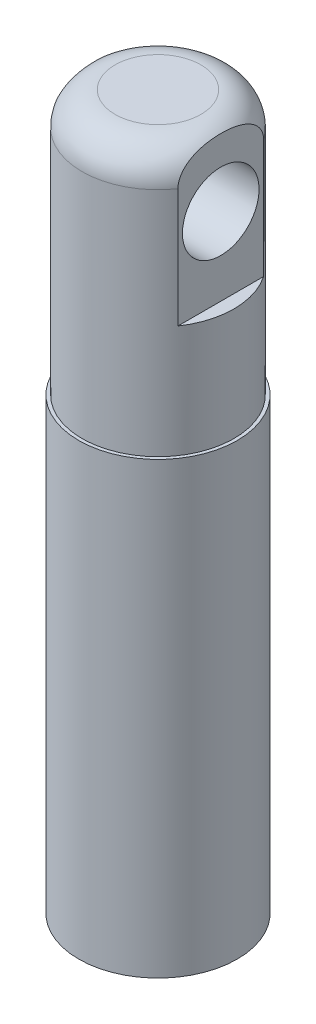
ISO-10303-21;
HEADER;
FILE_DESCRIPTION(('STEP AP214'),'2;1');
FILE_NAME('part.step','',(''),(''),'','','');
FILE_SCHEMA(('AUTOMOTIVE_DESIGN { 1 0 10303 214 1 1 1 1 }'));
ENDSEC;
DATA;
#1=APPLICATION_CONTEXT('core data for automotive mechanical design processes');
#2=APPLICATION_PROTOCOL_DEFINITION('international standard','automotive_design',2000,#1);
#3=PRODUCT_CONTEXT('',#1,'mechanical');
#4=PRODUCT('Part','Part','',(#3));
#5=PRODUCT_RELATED_PRODUCT_CATEGORY('part','',(#4));
#6=PRODUCT_DEFINITION_FORMATION('','',#4);
#7=PRODUCT_DEFINITION_CONTEXT('part definition',#1,'design');
#8=PRODUCT_DEFINITION('design','',#6,#7);
#9=PRODUCT_DEFINITION_SHAPE('','',#8);
#10=(LENGTH_UNIT() NAMED_UNIT(*) SI_UNIT(.MILLI.,.METRE.));
#11=(NAMED_UNIT(*) PLANE_ANGLE_UNIT() SI_UNIT($,.RADIAN.));
#12=(NAMED_UNIT(*) SI_UNIT($,.STERADIAN.) SOLID_ANGLE_UNIT());
#13=UNCERTAINTY_MEASURE_WITH_UNIT(LENGTH_MEASURE(1.E-05),#10,'distance_accuracy_value','');
#14=(GEOMETRIC_REPRESENTATION_CONTEXT(3) GLOBAL_UNCERTAINTY_ASSIGNED_CONTEXT((#13)) GLOBAL_UNIT_ASSIGNED_CONTEXT((#10,
#11,#12)) REPRESENTATION_CONTEXT('',''));
#15=CARTESIAN_POINT('',(0.,0.,0.));
#16=DIRECTION('',(0.,0.,1.));
#17=DIRECTION('',(1.,0.,0.));
#18=AXIS2_PLACEMENT_3D('',#15,#16,#17);
#19=CARTESIAN_POINT('',(0.,0.,0.));
#20=DIRECTION('',(0.,1.,0.));
#21=DIRECTION('',(0.,0.,1.));
#22=AXIS2_PLACEMENT_3D('',#19,#20,#21);
#23=PLANE('',#22);
#24=CARTESIAN_POINT('',(0.,0.,0.));
#25=DIRECTION('',(0.,-1.,0.));
#26=DIRECTION('',(0.,0.,-1.));
#27=AXIS2_PLACEMENT_3D('',#24,#25,#26);
#28=CIRCLE('',#27,9.5);
#29=CARTESIAN_POINT('',(0.,0.,-9.5));
#30=VERTEX_POINT('',#29);
#31=EDGE_CURVE('E112',#30,#30,#28,.T.);
#32=ORIENTED_EDGE('',*,*,#31,.F.);
#33=EDGE_LOOP('',(#32));
#34=FACE_BOUND('',#33,.T.);
#35=CARTESIAN_POINT('',(0.,0.,0.));
#36=DIRECTION('',(0.,-1.,0.));
#37=DIRECTION('',(0.,0.,-1.));
#38=AXIS2_PLACEMENT_3D('',#35,#36,#37);
#39=CIRCLE('',#38,12.);
#40=CARTESIAN_POINT('',(0.,0.,-12.));
#41=VERTEX_POINT('',#40);
#42=EDGE_CURVE('E325',#41,#41,#39,.T.);
#43=ORIENTED_EDGE('',*,*,#42,.T.);
#44=EDGE_LOOP('',(#43));
#45=FACE_BOUND('',#44,.T.);
#46=ADVANCED_FACE('F41',(#34,#45),#23,.F.);
#47=CARTESIAN_POINT('',(0.,80.,0.));
#48=DIRECTION('',(0.,-1.,0.));
#49=DIRECTION('',(0.,0.,-1.));
#50=AXIS2_PLACEMENT_3D('',#47,#48,#49);
#51=CYLINDRICAL_SURFACE('',#50,9.5);
#52=CARTESIAN_POINT('',(0.,8.99999999999999,0.));
#53=DIRECTION('',(0.,-1.,0.));
#54=DIRECTION('',(0.,0.,-1.));
#55=AXIS2_PLACEMENT_3D('',#52,#53,#54);
#56=CIRCLE('',#55,9.5);
#57=CARTESIAN_POINT('',(0.,8.99999999999999,-9.5));
#58=VERTEX_POINT('',#57);
#59=EDGE_CURVE('E90',#58,#58,#56,.F.);
#60=ORIENTED_EDGE('',*,*,#59,.T.);
#61=EDGE_LOOP('',(#60));
#62=FACE_BOUND('',#61,.T.);
#63=ORIENTED_EDGE('',*,*,#31,.T.);
#64=EDGE_LOOP('',(#63));
#65=FACE_BOUND('',#64,.T.);
#66=ADVANCED_FACE('F147',(#62,#65),#51,.F.);
#67=CARTESIAN_POINT('',(0.,9.,0.));
#68=DIRECTION('',(0.,-1.,0.));
#69=DIRECTION('',(0.,0.,-1.));
#70=AXIS2_PLACEMENT_3D('',#67,#68,#69);
#71=PLANE('',#70);
#72=CARTESIAN_POINT('',(0.,9.,0.));
#73=DIRECTION('',(0.,-1.,0.));
#74=DIRECTION('',(0.,0.,-1.));
#75=AXIS2_PLACEMENT_3D('',#72,#73,#74);
#76=CIRCLE('',#75,10.5);
#77=CARTESIAN_POINT('',(0.,9.,-10.5));
#78=VERTEX_POINT('',#77);
#79=EDGE_CURVE('E314',#78,#78,#76,.T.);
#80=ORIENTED_EDGE('',*,*,#79,.F.);
#81=EDGE_LOOP('',(#80));
#82=FACE_BOUND('',#81,.T.);
#83=ORIENTED_EDGE('',*,*,#59,.F.);
#84=EDGE_LOOP('',(#83));
#85=FACE_BOUND('',#84,.T.);
#86=ADVANCED_FACE('F150',(#82,#85),#71,.F.);
#87=CARTESIAN_POINT('',(0.,10.,0.));
#88=DIRECTION('',(0.,-1.,0.));
#89=DIRECTION('',(0.,0.,-1.));
#90=AXIS2_PLACEMENT_3D('',#87,#88,#89);
#91=PLANE('',#90);
#92=CARTESIAN_POINT('',(0.,10.,0.));
#93=DIRECTION('',(0.,-1.,0.));
#94=DIRECTION('',(0.,0.,-1.));
#95=AXIS2_PLACEMENT_3D('',#92,#93,#94);
#96=CIRCLE('',#95,10.5);
#97=CARTESIAN_POINT('',(0.,10.,-10.5));
#98=VERTEX_POINT('',#97);
#99=EDGE_CURVE('E318',#98,#98,#96,.T.);
#100=ORIENTED_EDGE('',*,*,#99,.T.);
#101=EDGE_LOOP('',(#100));
#102=FACE_BOUND('',#101,.T.);
#103=CARTESIAN_POINT('',(0.,9.99999999999999,0.));
#104=DIRECTION('',(0.,-1.,0.));
#105=DIRECTION('',(0.,0.,-1.));
#106=AXIS2_PLACEMENT_3D('',#103,#104,#105);
#107=CIRCLE('',#106,9.5);
#108=CARTESIAN_POINT('',(0.,9.99999999999999,-9.5));
#109=VERTEX_POINT('',#108);
#110=EDGE_CURVE('E312',#109,#109,#107,.F.);
#111=ORIENTED_EDGE('',*,*,#110,.T.);
#112=EDGE_LOOP('',(#111));
#113=FACE_BOUND('',#112,.T.);
#114=ADVANCED_FACE('F248',(#102,#113),#91,.T.);
#115=CARTESIAN_POINT('',(0.,9.,0.));
#116=DIRECTION('',(0.,1.,0.));
#117=DIRECTION('',(0.,0.,1.));
#118=AXIS2_PLACEMENT_3D('',#115,#116,#117);
#119=CYLINDRICAL_SURFACE('',#118,10.5);
#120=ORIENTED_EDGE('',*,*,#79,.T.);
#121=EDGE_LOOP('',(#120));
#122=FACE_BOUND('',#121,.T.);
#123=ORIENTED_EDGE('',*,*,#99,.F.);
#124=EDGE_LOOP('',(#123));
#125=FACE_BOUND('',#124,.T.);
#126=ADVANCED_FACE('F145',(#122,#125),#119,.F.);
#127=CARTESIAN_POINT('',(0.,80.,0.));
#128=DIRECTION('',(0.,-1.,0.));
#129=DIRECTION('',(0.,0.,-1.));
#130=AXIS2_PLACEMENT_3D('',#127,#128,#129);
#131=PLANE('',#130);
#132=CARTESIAN_POINT('',(0.,80.,0.));
#133=DIRECTION('',(0.,-1.,0.));
#134=DIRECTION('',(0.,0.,-1.));
#135=AXIS2_PLACEMENT_3D('',#132,#133,#134);
#136=CIRCLE('',#135,9.5);
#137=CARTESIAN_POINT('',(0.,80.,-9.5));
#138=VERTEX_POINT('',#137);
#139=EDGE_CURVE('E114',#138,#138,#136,.T.);
#140=ORIENTED_EDGE('',*,*,#139,.T.);
#141=EDGE_LOOP('',(#140));
#142=FACE_BOUND('',#141,.T.);
#143=ADVANCED_FACE('F141',(#142),#131,.T.);
#144=ORIENTED_EDGE('',*,*,#139,.F.);
#145=EDGE_LOOP('',(#144));
#146=FACE_BOUND('',#145,.T.);
#147=ORIENTED_EDGE('',*,*,#110,.F.);
#148=EDGE_LOOP('',(#147));
#149=FACE_BOUND('',#148,.T.);
#150=ADVANCED_FACE('F144',(#146,#149),#51,.F.);
#151=CARTESIAN_POINT('',(0.,68.,0.));
#152=DIRECTION('',(0.,-1.,0.));
#153=DIRECTION('',(0.,0.,-1.));
#154=AXIS2_PLACEMENT_3D('',#151,#152,#153);
#155=CYLINDRICAL_SURFACE('',#154,12.);
#156=CARTESIAN_POINT('',(0.,68.,0.));
#157=DIRECTION('',(0.,-1.,0.));
#158=DIRECTION('',(0.,0.,-1.));
#159=AXIS2_PLACEMENT_3D('',#156,#157,#158);
#160=CIRCLE('',#159,12.);
#161=CARTESIAN_POINT('',(0.,68.,-12.));
#162=VERTEX_POINT('',#161);
#163=EDGE_CURVE('E322',#162,#162,#160,.T.);
#164=ORIENTED_EDGE('',*,*,#163,.T.);
#165=EDGE_LOOP('',(#164));
#166=FACE_BOUND('',#165,.T.);
#167=ORIENTED_EDGE('',*,*,#42,.F.);
#168=EDGE_LOOP('',(#167));
#169=FACE_BOUND('',#168,.T.);
#170=ADVANCED_FACE('F215',(#166,#169),#155,.T.);
#171=CARTESIAN_POINT('',(0.,68.,0.));
#172=DIRECTION('',(0.,-1.,0.));
#173=DIRECTION('',(0.,0.,-1.));
#174=AXIS2_PLACEMENT_3D('',#171,#172,#173);
#175=PLANE('',#174);
#176=CARTESIAN_POINT('',(0.,68.,0.));
#177=DIRECTION('',(0.,-1.,0.));
#178=DIRECTION('',(0.,0.,-1.));
#179=AXIS2_PLACEMENT_3D('',#176,#177,#178);
#180=CIRCLE('',#179,11.5);
#181=CARTESIAN_POINT('',(0.,68.,-11.5));
#182=VERTEX_POINT('',#181);
#183=EDGE_CURVE('E11',#182,#182,#180,.T.);
#184=ORIENTED_EDGE('',*,*,#183,.T.);
#185=EDGE_LOOP('',(#184));
#186=FACE_BOUND('',#185,.T.);
#187=ORIENTED_EDGE('',*,*,#163,.F.);
#188=EDGE_LOOP('',(#187));
#189=FACE_BOUND('',#188,.T.);
#190=ADVANCED_FACE('F155',(#186,#189),#175,.F.);
#191=CARTESIAN_POINT('',(0.,108.,0.));
#192=DIRECTION('',(0.,1.,0.));
#193=DIRECTION('',(0.,0.,1.));
#194=AXIS2_PLACEMENT_3D('',#191,#192,#193);
#195=PLANE('',#194);
#196=CARTESIAN_POINT('',(0.,108.,0.));
#197=DIRECTION('',(0.,1.,0.));
#198=DIRECTION('',(0.,0.,1.));
#199=AXIS2_PLACEMENT_3D('',#196,#197,#198);
#200=CIRCLE('',#199,6.5);
#201=CARTESIAN_POINT('',(0.,108.,6.5));
#202=VERTEX_POINT('',#201);
#203=EDGE_CURVE('E117',#202,#202,#200,.T.);
#204=ORIENTED_EDGE('',*,*,#203,.T.);
#205=EDGE_LOOP('',(#204));
#206=FACE_BOUND('',#205,.T.);
#207=ADVANCED_FACE('F152',(#206),#195,.T.);
#208=CARTESIAN_POINT('',(0.,85.,0.));
#209=DIRECTION('',(0.,1.,0.));
#210=DIRECTION('',(0.,0.,1.));
#211=AXIS2_PLACEMENT_3D('',#208,#209,#210);
#212=PLANE('',#211);
#213=CARTESIAN_POINT('',(0.,85.,0.));
#214=DIRECTION('',(0.,1.,0.));
#215=DIRECTION('',(0.,0.,1.));
#216=AXIS2_PLACEMENT_3D('',#213,#214,#215);
#217=CIRCLE('',#216,11.5);
#218=CARTESIAN_POINT('',(-9.5,85.,-6.48074069840787));
#219=VERTEX_POINT('',#218);
#220=CARTESIAN_POINT('',(-9.5,85.,6.48074069840787));
#221=VERTEX_POINT('',#220);
#222=EDGE_CURVE('E102',#219,#221,#217,.T.);
#223=ORIENTED_EDGE('',*,*,#222,.T.);
#224=DIRECTION('',(0.,0.,-1.));
#225=VECTOR('',#224,1.);
#226=CARTESIAN_POINT('',(-9.5,85.,-6.48074069840787));
#227=LINE('',#226,#225);
#228=EDGE_CURVE('E106',#221,#219,#227,.T.);
#229=ORIENTED_EDGE('',*,*,#228,.T.);
#230=EDGE_LOOP('',(#223,#229));
#231=FACE_BOUND('',#230,.T.);
#232=ADVANCED_FACE('F139',(#231),#212,.T.);
#233=CARTESIAN_POINT('',(-9.5,85.,-6.48074069840787));
#234=DIRECTION('',(1.,0.,0.));
#235=DIRECTION('',(0.,0.,-1.));
#236=AXIS2_PLACEMENT_3D('',#233,#234,#235);
#237=PLANE('',#236);
#238=CARTESIAN_POINT('',(-9.5,96.8,0.));
#239=DIRECTION('',(-1.,0.,0.));
#240=DIRECTION('',(0.,0.,1.));
#241=AXIS2_PLACEMENT_3D('',#238,#239,#240);
#242=CIRCLE('',#241,5.8);
#243=CARTESIAN_POINT('',(-9.5,96.8,5.8));
#244=VERTEX_POINT('',#243);
#245=EDGE_CURVE('E330',#244,#244,#242,.T.);
#246=ORIENTED_EDGE('',*,*,#245,.F.);
#247=EDGE_LOOP('',(#246));
#248=FACE_BOUND('',#247,.T.);
#249=CARTESIAN_POINT('',(-9.5,107.,0.));
#250=CARTESIAN_POINT('',(-9.5,107.000013449951,-0.319427822509701));
#251=CARTESIAN_POINT('',(-9.5,106.988017076986,-0.63892006590392));
#252=CARTESIAN_POINT('',(-9.5,106.938857323271,-1.27628521801685));
#253=CARTESIAN_POINT('',(-9.5,106.901671533057,-1.59415643068887));
#254=CARTESIAN_POINT('',(-9.5,106.798831607022,-2.22394198187162));
#255=CARTESIAN_POINT('',(-9.5,106.733305512437,-2.53587660109372));
#256=CARTESIAN_POINT('',(-9.5,106.568407722902,-3.15039211990225));
#257=CARTESIAN_POINT('',(-9.5,106.469101733711,-3.45298994361904));
#258=CARTESIAN_POINT('',(-9.5,106.257522124226,-3.97314599593014));
#259=CARTESIAN_POINT('',(-9.5,106.153666948261,-4.19408526995521));
#260=CARTESIAN_POINT('',(-9.5,105.918501990023,-4.62113765791603));
#261=CARTESIAN_POINT('',(-9.5,105.787187513449,-4.8272482287043));
#262=CARTESIAN_POINT('',(-9.5,105.492318517682,-5.21955935233824));
#263=CARTESIAN_POINT('',(-9.5,105.328400173196,-5.40549484136667));
#264=CARTESIAN_POINT('',(-9.5,105.058941889159,-5.65891095487052));
#265=CARTESIAN_POINT('',(-9.5,104.965236059143,-5.73910716779697));
#266=CARTESIAN_POINT('',(-9.5,104.77019289869,-5.88956112695986));
#267=CARTESIAN_POINT('',(-9.5,104.668859358059,-5.959823759372));
#268=CARTESIAN_POINT('',(-9.5,104.418624631359,-6.11367885088264));
#269=CARTESIAN_POINT('',(-9.5,104.266415813687,-6.19200770675544));
#270=CARTESIAN_POINT('',(-9.5,103.951141816376,-6.3223448961748));
#271=CARTESIAN_POINT('',(-9.5,103.788083924691,-6.37437070098581));
#272=CARTESIAN_POINT('',(-9.5,103.454530264585,-6.44907597407117));
#273=CARTESIAN_POINT('',(-9.5,103.284004842897,-6.4716248969513));
#274=CARTESIAN_POINT('',(-9.5,102.941691933726,-6.48533584975927));
#275=CARTESIAN_POINT('',(-9.5,102.769904604124,-6.47650174155386));
#276=CARTESIAN_POINT('',(-9.5,102.442562096056,-6.42979811026733));
#277=CARTESIAN_POINT('',(-9.5,102.286706826141,-6.39398232679889));
#278=CARTESIAN_POINT('',(-9.5,101.982810231776,-6.29786140515809));
#279=CARTESIAN_POINT('',(-9.5,101.834769406153,-6.23755470576261));
#280=CARTESIAN_POINT('',(-9.5,101.542535099,-6.09209283059815));
#281=CARTESIAN_POINT('',(-9.5,101.398873507225,-6.00587742881792));
#282=CARTESIAN_POINT('',(-9.5,101.125319379357,-5.81392724867521));
#283=CARTESIAN_POINT('',(-9.5,100.995435100828,-5.7081808671449));
#284=CARTESIAN_POINT('',(-9.5,100.687077862457,-5.42250045119694));
#285=CARTESIAN_POINT('',(-9.5,100.518012175842,-5.23239897739187));
#286=CARTESIAN_POINT('',(-9.5,100.212459774571,-4.82765362850405));
#287=CARTESIAN_POINT('',(-9.5,100.076039207576,-4.61296120489021));
#288=CARTESIAN_POINT('',(-9.5,99.8614050292085,-4.22000411781555));
#289=CARTESIAN_POINT('',(-9.5,99.7770446525986,-4.04501383563985));
#290=CARTESIAN_POINT('',(-9.5,99.6239155649386,-3.68826875505267));
#291=CARTESIAN_POINT('',(-9.5,99.5551556707456,-3.50651019865708));
#292=CARTESIAN_POINT('',(-9.5,99.4314555977816,-3.13786064624299));
#293=CARTESIAN_POINT('',(-9.5,99.376553665877,-2.95095699137289));
#294=CARTESIAN_POINT('',(-9.5,99.2792546930605,-2.57388268082105));
#295=CARTESIAN_POINT('',(-9.5,99.2368622262308,-2.38371085696474));
#296=CARTESIAN_POINT('',(-9.5,99.168993365226,-2.03079962649426));
#297=CARTESIAN_POINT('',(-9.5,99.1419151969633,-1.8683626717927));
#298=CARTESIAN_POINT('',(-9.5,99.09514785924,-1.54241049941394));
#299=CARTESIAN_POINT('',(-9.5,99.0754597373571,-1.37889513220662));
#300=CARTESIAN_POINT('',(-9.5,99.0429819616578,-1.05107016872485));
#301=CARTESIAN_POINT('',(-9.5,99.0301972358177,-0.886760089343081));
#302=CARTESIAN_POINT('',(-9.5,99.011221076751,-0.557740366031048));
#303=CARTESIAN_POINT('',(-9.5,99.0050305420207,-0.393030670714525));
#304=CARTESIAN_POINT('',(-9.5,98.9990862822697,-0.0635510949326198));
#305=CARTESIAN_POINT('',(-9.5,98.9993304162499,0.101218747273402));
#306=CARTESIAN_POINT('',(-9.5,99.0062561663826,0.430603318065509));
#307=CARTESIAN_POINT('',(-9.5,99.012936967878,0.595218063642268));
#308=CARTESIAN_POINT('',(-9.5,99.0329010231058,0.9239390966893));
#309=CARTESIAN_POINT('',(-9.5,99.0461798044369,1.08804565291549));
#310=CARTESIAN_POINT('',(-9.5,99.0796722559188,1.41553309087966));
#311=CARTESIAN_POINT('',(-9.5,99.0998850674893,1.57891405992492));
#312=CARTESIAN_POINT('',(-9.5,99.1508414082791,1.92570414329739));
#313=CARTESIAN_POINT('',(-9.5,99.1826101250516,2.10896513652259));
#314=CARTESIAN_POINT('',(-9.5,99.2565602438848,2.47334425431144));
#315=CARTESIAN_POINT('',(-9.5,99.2987389698424,2.65446291708439));
#316=CARTESIAN_POINT('',(-9.5,99.3945991213125,3.01331979926301));
#317=CARTESIAN_POINT('',(-9.5,99.4482594339486,3.19106358006571));
#318=CARTESIAN_POINT('',(-9.5,99.5684469730573,3.54210211143921));
#319=CARTESIAN_POINT('',(-9.5,99.634970504026,3.71539812366123));
#320=CARTESIAN_POINT('',(-9.5,99.8179794399782,4.13813901146517));
#321=CARTESIAN_POINT('',(-9.5,99.9430828956434,4.38397198031803));
#322=CARTESIAN_POINT('',(-9.5,100.229597654657,4.85372803849165));
#323=CARTESIAN_POINT('',(-9.5,100.390961000338,5.07767951218125));
#324=CARTESIAN_POINT('',(-9.5,100.704827566521,5.43634978188837));
#325=CARTESIAN_POINT('',(-9.5,100.848267240981,5.5789574271694));
#326=CARTESIAN_POINT('',(-9.5,101.156161398147,5.83942978403776));
#327=CARTESIAN_POINT('',(-9.5,101.320589340709,5.95732525567386));
#328=CARTESIAN_POINT('',(-9.5,101.641201141389,6.14560462799638));
#329=CARTESIAN_POINT('',(-9.5,101.794712127358,6.22052046658114));
#330=CARTESIAN_POINT('',(-9.5,102.11215130195,6.34369074182498));
#331=CARTESIAN_POINT('',(-9.5,102.276075071065,6.39195640644751));
#332=CARTESIAN_POINT('',(-9.5,102.61061133413,6.45888801308082));
#333=CARTESIAN_POINT('',(-9.5,102.781247974893,6.47743470200473));
#334=CARTESIAN_POINT('',(-9.5,103.123047475646,6.48323400014352));
#335=CARTESIAN_POINT('',(-9.5,103.294210258942,6.47049097272776));
#336=CARTESIAN_POINT('',(-9.5,103.619885561047,6.41656478854412));
#337=CARTESIAN_POINT('',(-9.5,103.774736919541,6.37738316882944));
#338=CARTESIAN_POINT('',(-9.5,104.076196474528,6.27494828890739));
#339=CARTESIAN_POINT('',(-9.5,104.222803697015,6.21169219124401));
#340=CARTESIAN_POINT('',(-9.5,104.513098470704,6.06002611127316));
#341=CARTESIAN_POINT('',(-9.5,104.656136026392,5.97038127987868));
#342=CARTESIAN_POINT('',(-9.5,104.928041234282,5.77183384519629));
#343=CARTESIAN_POINT('',(-9.5,105.05690243213,5.66292252843974));
#344=CARTESIAN_POINT('',(-9.5,105.364511604279,5.3675956630658));
#345=CARTESIAN_POINT('',(-9.5,105.533295230013,5.17078704006052));
#346=CARTESIAN_POINT('',(-9.5,105.837413356307,4.75267740204993));
#347=CARTESIAN_POINT('',(-9.5,105.972654995348,4.53131079376334));
#348=CARTESIAN_POINT('',(-9.5,106.185521890063,4.1250965782032));
#349=CARTESIAN_POINT('',(-9.5,106.269256938685,3.94337033918116));
#350=CARTESIAN_POINT('',(-9.5,106.420550885405,3.57322419441269));
#351=CARTESIAN_POINT('',(-9.5,106.488099778883,3.38480023101036));
#352=CARTESIAN_POINT('',(-9.5,106.608772897115,3.00337458169272));
#353=CARTESIAN_POINT('',(-9.5,106.661891601057,2.81037117435867));
#354=CARTESIAN_POINT('',(-9.5,106.755278253589,2.42135592845316));
#355=CARTESIAN_POINT('',(-9.5,106.795548880208,2.22534472576004));
#356=CARTESIAN_POINT('',(-9.5,106.859352949034,1.86120717466358));
#357=CARTESIAN_POINT('',(-9.5,106.884498154994,1.6933578247797));
#358=CARTESIAN_POINT('',(-9.5,106.927143905061,1.35670942886085));
#359=CARTESIAN_POINT('',(-9.5,106.944645016445,1.18791045424064));
#360=CARTESIAN_POINT('',(-9.5,106.972497660783,0.84940686905127));
#361=CARTESIAN_POINT('',(-9.5,106.982835640113,0.679701150599276));
#362=CARTESIAN_POINT('',(-9.5,106.996583611775,0.340003057349438));
#363=CARTESIAN_POINT('',(-9.5,106.999992841466,0.170010653057098));
#364=CARTESIAN_POINT('',(-9.5,107.,0.));
#365=B_SPLINE_CURVE_WITH_KNOTS('',3,(#249,#250,#251,#252,#253,#254,#255,#256,#257,#258,#259,
#260,#261,#262,#263,#264,#265,#266,#267,#268,#269,#270,#271,#272,#273,#274,#275,#276,#277,#278,
#279,#280,#281,#282,#283,#284,#285,#286,#287,#288,#289,#290,#291,#292,#293,#294,#295,#296,#297,
#298,#299,#300,#301,#302,#303,#304,#305,#306,#307,#308,#309,#310,#311,#312,#313,#314,#315,#316,
#317,#318,#319,#320,#321,#322,#323,#324,#325,#326,#327,#328,#329,#330,#331,#332,#333,#334,#335,
#336,#337,#338,#339,#340,#341,#342,#343,#344,#345,#346,#347,#348,#349,#350,#351,#352,#353,#354,
#355,#356,#357,#358,#359,#360,#361,#362,#363,#364),.UNSPECIFIED.,.T.,.F.,(4,2,2,2,2,2,2,2,2,2,2,
2,2,2,2,2,2,2,2,2,2,2,2,2,2,2,2,2,2,2,2,2,2,2,2,2,2,2,2,2,2,2,2,2,2,2,2,2,2,2,2,2,2,2,2,2,2,4),
(0.,0.958158207260657,1.91716994991136,2.87189342079582,3.82477036471835,4.55553429743221,
5.28642326010073,6.02597878492089,6.39545034158805,6.76473952381114,7.27603197711763,
7.78698436719131,8.30019205012159,8.81333658201243,9.29093444864841,9.76856276550992,
10.2692789491054,10.7702935658509,11.5292241492258,12.28967974688,12.8716819471224,
13.4540122601845,14.0379326050398,14.6220661963775,15.115926704169,15.6098571928589,
16.1041398083293,16.598489764023,17.0926752373688,17.586798172333,18.0805866250086,
18.5743139582438,19.1320194124377,19.6895816462353,20.2461272871279,20.8025132736631,
21.6274125334604,22.4512271291817,23.0558758575014,23.6597674308806,24.1700512325004,
24.6801198824995,25.1922302010158,25.7042691095026,26.1813420141754,26.6584711648366,
27.1629723240733,27.6677022352717,28.4411410611374,29.216697843817,29.8161501383794,
30.4159720026442,31.0160230292097,31.6159489004295,32.1249354584039,32.6338842374568,
33.1437934065381,33.653758697816),.UNSPECIFIED.);
#366=CARTESIAN_POINT('',(-9.5,103.,6.48074069840786));
#367=VERTEX_POINT('',#366);
#368=CARTESIAN_POINT('',(-9.5,103.000000000001,-6.48074069840787));
#369=VERTEX_POINT('',#368);
#370=EDGE_CURVE('E123',#367,#369,#365,.T.);
#371=ORIENTED_EDGE('',*,*,#370,.T.);
#372=DIRECTION('',(0.,1.,0.));
#373=VECTOR('',#372,1.);
#374=CARTESIAN_POINT('',(-9.5,85.,-6.48074069840787));
#375=LINE('',#374,#373);
#376=EDGE_CURVE('E110',#219,#369,#375,.T.);
#377=ORIENTED_EDGE('',*,*,#376,.F.);
#378=ORIENTED_EDGE('',*,*,#228,.F.);
#379=DIRECTION('',(0.,1.,0.));
#380=VECTOR('',#379,1.);
#381=CARTESIAN_POINT('',(-9.5,85.,6.48074069840787));
#382=LINE('',#381,#380);
#383=EDGE_CURVE('E109',#221,#367,#382,.T.);
#384=ORIENTED_EDGE('',*,*,#383,.T.);
#385=EDGE_LOOP('',(#371,#377,#378,#384));
#386=FACE_BOUND('',#385,.T.);
#387=ADVANCED_FACE('F134',(#248,#386),#237,.F.);
#388=CARTESIAN_POINT('',(0.,85.,0.));
#389=DIRECTION('',(0.,1.,0.));
#390=DIRECTION('',(0.,0.,1.));
#391=AXIS2_PLACEMENT_3D('',#388,#389,#390);
#392=PLANE('',#391);
#393=CARTESIAN_POINT('',(0.,85.,0.));
#394=DIRECTION('',(0.,1.,0.));
#395=DIRECTION('',(0.,0.,1.));
#396=AXIS2_PLACEMENT_3D('',#393,#394,#395);
#397=CIRCLE('',#396,11.5);
#398=CARTESIAN_POINT('',(9.5,85.,6.48074069840787));
#399=VERTEX_POINT('',#398);
#400=CARTESIAN_POINT('',(9.5,85.,-6.48074069840787));
#401=VERTEX_POINT('',#400);
#402=EDGE_CURVE('E87',#399,#401,#397,.T.);
#403=ORIENTED_EDGE('',*,*,#402,.T.);
#404=DIRECTION('',(0.,0.,1.));
#405=VECTOR('',#404,1.);
#406=CARTESIAN_POINT('',(9.5,85.,-6.48074069840787));
#407=LINE('',#406,#405);
#408=EDGE_CURVE('E89',#401,#399,#407,.T.);
#409=ORIENTED_EDGE('',*,*,#408,.T.);
#410=EDGE_LOOP('',(#403,#409));
#411=FACE_BOUND('',#410,.T.);
#412=ADVANCED_FACE('F88',(#411),#392,.T.);
#413=CARTESIAN_POINT('',(9.5,85.,-6.48074069840787));
#414=DIRECTION('',(-1.,0.,0.));
#415=DIRECTION('',(0.,0.,1.));
#416=AXIS2_PLACEMENT_3D('',#413,#414,#415);
#417=PLANE('',#416);
#418=CARTESIAN_POINT('',(9.5,96.8,0.));
#419=DIRECTION('',(-1.,0.,0.));
#420=DIRECTION('',(0.,0.,1.));
#421=AXIS2_PLACEMENT_3D('',#418,#419,#420);
#422=CIRCLE('',#421,5.8);
#423=CARTESIAN_POINT('',(9.5,96.8,5.8));
#424=VERTEX_POINT('',#423);
#425=EDGE_CURVE('E46',#424,#424,#422,.T.);
#426=ORIENTED_EDGE('',*,*,#425,.T.);
#427=EDGE_LOOP('',(#426));
#428=FACE_BOUND('',#427,.T.);
#429=CARTESIAN_POINT('',(9.5,107.,0.));
#430=CARTESIAN_POINT('',(9.5,107.000013449951,0.319427822509701));
#431=CARTESIAN_POINT('',(9.5,106.988017076986,0.63892006590392));
#432=CARTESIAN_POINT('',(9.5,106.938857323271,1.27628521801685));
#433=CARTESIAN_POINT('',(9.5,106.901671533057,1.59415643068887));
#434=CARTESIAN_POINT('',(9.5,106.798831607022,2.22394198187162));
#435=CARTESIAN_POINT('',(9.5,106.733305512437,2.53587660109372));
#436=CARTESIAN_POINT('',(9.5,106.568407722902,3.15039211990225));
#437=CARTESIAN_POINT('',(9.5,106.469101733711,3.45298994361904));
#438=CARTESIAN_POINT('',(9.5,106.257522124226,3.97314599593014));
#439=CARTESIAN_POINT('',(9.5,106.153666948261,4.19408526995521));
#440=CARTESIAN_POINT('',(9.5,105.918501990023,4.62113765791603));
#441=CARTESIAN_POINT('',(9.5,105.787187513449,4.8272482287043));
#442=CARTESIAN_POINT('',(9.5,105.492318517682,5.21955935233824));
#443=CARTESIAN_POINT('',(9.5,105.328400173196,5.40549484136667));
#444=CARTESIAN_POINT('',(9.5,105.058941889159,5.65891095487052));
#445=CARTESIAN_POINT('',(9.5,104.965236059143,5.73910716779697));
#446=CARTESIAN_POINT('',(9.5,104.77019289869,5.88956112695986));
#447=CARTESIAN_POINT('',(9.5,104.668859358059,5.959823759372));
#448=CARTESIAN_POINT('',(9.5,104.418624631359,6.11367885088264));
#449=CARTESIAN_POINT('',(9.5,104.266415813687,6.19200770675544));
#450=CARTESIAN_POINT('',(9.5,103.951141816376,6.3223448961748));
#451=CARTESIAN_POINT('',(9.5,103.788083924691,6.37437070098581));
#452=CARTESIAN_POINT('',(9.5,103.454530264585,6.44907597407117));
#453=CARTESIAN_POINT('',(9.5,103.284004842897,6.4716248969513));
#454=CARTESIAN_POINT('',(9.5,102.941691933726,6.48533584975927));
#455=CARTESIAN_POINT('',(9.5,102.769904604124,6.47650174155386));
#456=CARTESIAN_POINT('',(9.5,102.442562096056,6.42979811026733));
#457=CARTESIAN_POINT('',(9.5,102.286706826141,6.39398232679889));
#458=CARTESIAN_POINT('',(9.5,101.982810231776,6.29786140515809));
#459=CARTESIAN_POINT('',(9.5,101.834769406153,6.23755470576261));
#460=CARTESIAN_POINT('',(9.5,101.542535099,6.09209283059815));
#461=CARTESIAN_POINT('',(9.5,101.398873507225,6.00587742881792));
#462=CARTESIAN_POINT('',(9.5,101.125319379357,5.81392724867521));
#463=CARTESIAN_POINT('',(9.5,100.995435100828,5.7081808671449));
#464=CARTESIAN_POINT('',(9.5,100.687077862457,5.42250045119694));
#465=CARTESIAN_POINT('',(9.5,100.518012175842,5.23239897739187));
#466=CARTESIAN_POINT('',(9.5,100.212459774571,4.82765362850405));
#467=CARTESIAN_POINT('',(9.5,100.076039207576,4.61296120489021));
#468=CARTESIAN_POINT('',(9.5,99.8614050292085,4.22000411781555));
#469=CARTESIAN_POINT('',(9.5,99.7770446525986,4.04501383563985));
#470=CARTESIAN_POINT('',(9.5,99.6239155649386,3.68826875505267));
#471=CARTESIAN_POINT('',(9.5,99.5551556707456,3.50651019865708));
#472=CARTESIAN_POINT('',(9.5,99.4314555977816,3.13786064624299));
#473=CARTESIAN_POINT('',(9.5,99.376553665877,2.95095699137289));
#474=CARTESIAN_POINT('',(9.5,99.2792546930605,2.57388268082105));
#475=CARTESIAN_POINT('',(9.5,99.2368622262308,2.38371085696474));
#476=CARTESIAN_POINT('',(9.5,99.168993365226,2.03079962649426));
#477=CARTESIAN_POINT('',(9.5,99.1419151969633,1.8683626717927));
#478=CARTESIAN_POINT('',(9.5,99.09514785924,1.54241049941394));
#479=CARTESIAN_POINT('',(9.5,99.0754597373571,1.37889513220662));
#480=CARTESIAN_POINT('',(9.5,99.0429819616578,1.05107016872485));
#481=CARTESIAN_POINT('',(9.5,99.0301972358177,0.886760089343081));
#482=CARTESIAN_POINT('',(9.5,99.011221076751,0.557740366031048));
#483=CARTESIAN_POINT('',(9.5,99.0050305420207,0.393030670714525));
#484=CARTESIAN_POINT('',(9.5,98.9990862822697,0.0635510949326198));
#485=CARTESIAN_POINT('',(9.5,98.9993304162499,-0.101218747273402));
#486=CARTESIAN_POINT('',(9.5,99.0062561663826,-0.430603318065509));
#487=CARTESIAN_POINT('',(9.5,99.012936967878,-0.595218063642268));
#488=CARTESIAN_POINT('',(9.5,99.0329010231058,-0.9239390966893));
#489=CARTESIAN_POINT('',(9.5,99.0461798044369,-1.08804565291549));
#490=CARTESIAN_POINT('',(9.5,99.0796722559188,-1.41553309087966));
#491=CARTESIAN_POINT('',(9.5,99.0998850674893,-1.57891405992492));
#492=CARTESIAN_POINT('',(9.5,99.1508414082791,-1.92570414329739));
#493=CARTESIAN_POINT('',(9.5,99.1826101250516,-2.10896513652259));
#494=CARTESIAN_POINT('',(9.5,99.2565602438848,-2.47334425431144));
#495=CARTESIAN_POINT('',(9.5,99.2987389698424,-2.65446291708439));
#496=CARTESIAN_POINT('',(9.5,99.3945991213125,-3.01331979926301));
#497=CARTESIAN_POINT('',(9.5,99.4482594339486,-3.19106358006571));
#498=CARTESIAN_POINT('',(9.5,99.5684469730573,-3.54210211143921));
#499=CARTESIAN_POINT('',(9.5,99.634970504026,-3.71539812366123));
#500=CARTESIAN_POINT('',(9.5,99.8179794399782,-4.13813901146517));
#501=CARTESIAN_POINT('',(9.5,99.9430828956434,-4.38397198031803));
#502=CARTESIAN_POINT('',(9.5,100.229597654657,-4.85372803849165));
#503=CARTESIAN_POINT('',(9.5,100.390961000338,-5.07767951218125));
#504=CARTESIAN_POINT('',(9.5,100.704827566521,-5.43634978188837));
#505=CARTESIAN_POINT('',(9.5,100.848267240981,-5.5789574271694));
#506=CARTESIAN_POINT('',(9.5,101.156161398147,-5.83942978403776));
#507=CARTESIAN_POINT('',(9.5,101.320589340709,-5.95732525567386));
#508=CARTESIAN_POINT('',(9.5,101.641201141389,-6.14560462799638));
#509=CARTESIAN_POINT('',(9.5,101.794712127358,-6.22052046658114));
#510=CARTESIAN_POINT('',(9.5,102.11215130195,-6.34369074182498));
#511=CARTESIAN_POINT('',(9.5,102.276075071065,-6.39195640644751));
#512=CARTESIAN_POINT('',(9.5,102.61061133413,-6.45888801308082));
#513=CARTESIAN_POINT('',(9.5,102.781247974893,-6.47743470200473));
#514=CARTESIAN_POINT('',(9.5,103.123047475646,-6.48323400014352));
#515=CARTESIAN_POINT('',(9.5,103.294210258942,-6.47049097272776));
#516=CARTESIAN_POINT('',(9.5,103.619885561047,-6.41656478854412));
#517=CARTESIAN_POINT('',(9.5,103.774736919541,-6.37738316882944));
#518=CARTESIAN_POINT('',(9.5,104.076196474528,-6.27494828890739));
#519=CARTESIAN_POINT('',(9.5,104.222803697015,-6.21169219124401));
#520=CARTESIAN_POINT('',(9.5,104.513098470704,-6.06002611127316));
#521=CARTESIAN_POINT('',(9.5,104.656136026392,-5.97038127987868));
#522=CARTESIAN_POINT('',(9.5,104.928041234282,-5.77183384519629));
#523=CARTESIAN_POINT('',(9.5,105.05690243213,-5.66292252843974));
#524=CARTESIAN_POINT('',(9.5,105.364511604279,-5.3675956630658));
#525=CARTESIAN_POINT('',(9.5,105.533295230013,-5.17078704006052));
#526=CARTESIAN_POINT('',(9.5,105.837413356307,-4.75267740204993));
#527=CARTESIAN_POINT('',(9.5,105.972654995348,-4.53131079376334));
#528=CARTESIAN_POINT('',(9.5,106.185521890063,-4.1250965782032));
#529=CARTESIAN_POINT('',(9.5,106.269256938685,-3.94337033918116));
#530=CARTESIAN_POINT('',(9.5,106.420550885405,-3.57322419441269));
#531=CARTESIAN_POINT('',(9.5,106.488099778883,-3.38480023101036));
#532=CARTESIAN_POINT('',(9.5,106.608772897115,-3.00337458169272));
#533=CARTESIAN_POINT('',(9.5,106.661891601057,-2.81037117435867));
#534=CARTESIAN_POINT('',(9.5,106.755278253589,-2.42135592845316));
#535=CARTESIAN_POINT('',(9.5,106.795548880208,-2.22534472576004));
#536=CARTESIAN_POINT('',(9.5,106.859352949034,-1.86120717466358));
#537=CARTESIAN_POINT('',(9.5,106.884498154994,-1.6933578247797));
#538=CARTESIAN_POINT('',(9.5,106.927143905061,-1.35670942886085));
#539=CARTESIAN_POINT('',(9.5,106.944645016445,-1.18791045424064));
#540=CARTESIAN_POINT('',(9.5,106.972497660783,-0.84940686905127));
#541=CARTESIAN_POINT('',(9.5,106.982835640113,-0.679701150599276));
#542=CARTESIAN_POINT('',(9.5,106.996583611775,-0.340003057349438));
#543=CARTESIAN_POINT('',(9.5,106.999992841466,-0.170010653057098));
#544=CARTESIAN_POINT('',(9.5,107.,0.));
#545=B_SPLINE_CURVE_WITH_KNOTS('',3,(#429,#430,#431,#432,#433,#434,#435,#436,#437,#438,#439,
#440,#441,#442,#443,#444,#445,#446,#447,#448,#449,#450,#451,#452,#453,#454,#455,#456,#457,#458,
#459,#460,#461,#462,#463,#464,#465,#466,#467,#468,#469,#470,#471,#472,#473,#474,#475,#476,#477,
#478,#479,#480,#481,#482,#483,#484,#485,#486,#487,#488,#489,#490,#491,#492,#493,#494,#495,#496,
#497,#498,#499,#500,#501,#502,#503,#504,#505,#506,#507,#508,#509,#510,#511,#512,#513,#514,#515,
#516,#517,#518,#519,#520,#521,#522,#523,#524,#525,#526,#527,#528,#529,#530,#531,#532,#533,#534,
#535,#536,#537,#538,#539,#540,#541,#542,#543,#544),.UNSPECIFIED.,.T.,.F.,(4,2,2,2,2,2,2,2,2,2,2,
2,2,2,2,2,2,2,2,2,2,2,2,2,2,2,2,2,2,2,2,2,2,2,2,2,2,2,2,2,2,2,2,2,2,2,2,2,2,2,2,2,2,2,2,2,2,4),
(0.,0.958158207260657,1.91716994991136,2.87189342079582,3.82477036471835,4.55553429743221,
5.28642326010073,6.02597878492089,6.39545034158805,6.76473952381114,7.27603197711763,
7.78698436719131,8.30019205012159,8.81333658201243,9.29093444864841,9.76856276550992,
10.2692789491054,10.7702935658509,11.5292241492258,12.28967974688,12.8716819471224,
13.4540122601845,14.0379326050398,14.6220661963775,15.115926704169,15.6098571928589,
16.1041398083293,16.598489764023,17.0926752373688,17.586798172333,18.0805866250086,
18.5743139582438,19.1320194124377,19.6895816462353,20.2461272871279,20.8025132736631,
21.6274125334604,22.4512271291817,23.0558758575014,23.6597674308806,24.1700512325004,
24.6801198824995,25.1922302010158,25.7042691095026,26.1813420141754,26.6584711648366,
27.1629723240733,27.6677022352717,28.4411410611374,29.216697843817,29.8161501383794,
30.4159720026442,31.0160230292097,31.6159489004295,32.1249354584039,32.6338842374568,
33.1437934065381,33.653758697816),.UNSPECIFIED.);
#546=CARTESIAN_POINT('',(9.5,103.,-6.48074069840786));
#547=VERTEX_POINT('',#546);
#548=CARTESIAN_POINT('',(9.5,103.000000000001,6.48074069840787));
#549=VERTEX_POINT('',#548);
#550=EDGE_CURVE('E51',#547,#549,#545,.T.);
#551=ORIENTED_EDGE('',*,*,#550,.T.);
#552=DIRECTION('',(0.,1.,0.));
#553=VECTOR('',#552,1.);
#554=CARTESIAN_POINT('',(9.5,85.,6.48074069840787));
#555=LINE('',#554,#553);
#556=EDGE_CURVE('E93',#399,#549,#555,.T.);
#557=ORIENTED_EDGE('',*,*,#556,.F.);
#558=ORIENTED_EDGE('',*,*,#408,.F.);
#559=DIRECTION('',(0.,1.,0.));
#560=VECTOR('',#559,1.);
#561=CARTESIAN_POINT('',(9.5,85.,-6.48074069840787));
#562=LINE('',#561,#560);
#563=EDGE_CURVE('E58',#401,#547,#562,.T.);
#564=ORIENTED_EDGE('',*,*,#563,.T.);
#565=EDGE_LOOP('',(#551,#557,#558,#564));
#566=FACE_BOUND('',#565,.T.);
#567=ADVANCED_FACE('F92',(#428,#566),#417,.F.);
#568=CARTESIAN_POINT('',(0.,103.,0.));
#569=DIRECTION('',(0.,1.,0.));
#570=DIRECTION('',(0.,0.,1.));
#571=AXIS2_PLACEMENT_3D('',#568,#569,#570);
#572=TOROIDAL_SURFACE('',#571,6.5,5.);
#573=ORIENTED_EDGE('',*,*,#550,.F.);
#574=CARTESIAN_POINT('',(0.,103.,0.));
#575=DIRECTION('',(0.,1.,0.));
#576=DIRECTION('',(0.,0.,1.));
#577=AXIS2_PLACEMENT_3D('',#574,#575,#576);
#578=CIRCLE('',#577,11.5);
#579=EDGE_CURVE('E100',#369,#547,#578,.F.);
#580=ORIENTED_EDGE('',*,*,#579,.F.);
#581=ORIENTED_EDGE('',*,*,#370,.F.);
#582=EDGE_CURVE('E66',#549,#367,#578,.F.);
#583=ORIENTED_EDGE('',*,*,#582,.F.);
#584=EDGE_LOOP('',(#573,#580,#581,#583));
#585=FACE_BOUND('',#584,.T.);
#586=ORIENTED_EDGE('',*,*,#203,.F.);
#587=EDGE_LOOP('',(#586));
#588=FACE_BOUND('',#587,.T.);
#589=ADVANCED_FACE('F43',(#585,#588),#572,.T.);
#590=CARTESIAN_POINT('',(0.,108.,0.));
#591=DIRECTION('',(0.,-1.,0.));
#592=DIRECTION('',(0.,0.,-1.));
#593=AXIS2_PLACEMENT_3D('',#590,#591,#592);
#594=CYLINDRICAL_SURFACE('',#593,11.5);
#595=ORIENTED_EDGE('',*,*,#579,.T.);
#596=ORIENTED_EDGE('',*,*,#563,.F.);
#597=ORIENTED_EDGE('',*,*,#402,.F.);
#598=ORIENTED_EDGE('',*,*,#556,.T.);
#599=ORIENTED_EDGE('',*,*,#582,.T.);
#600=ORIENTED_EDGE('',*,*,#383,.F.);
#601=ORIENTED_EDGE('',*,*,#222,.F.);
#602=ORIENTED_EDGE('',*,*,#376,.T.);
#603=EDGE_LOOP('',(#595,#596,#597,#598,#599,#600,#601,#602));
#604=FACE_BOUND('',#603,.T.);
#605=ORIENTED_EDGE('',*,*,#183,.F.);
#606=EDGE_LOOP('',(#605));
#607=FACE_BOUND('',#606,.T.);
#608=ADVANCED_FACE('F96',(#604,#607),#594,.T.);
#609=CARTESIAN_POINT('',(12.,96.8,0.));
#610=DIRECTION('',(-1.,0.,0.));
#611=DIRECTION('',(0.,0.,1.));
#612=AXIS2_PLACEMENT_3D('',#609,#610,#611);
#613=CYLINDRICAL_SURFACE('',#612,5.8);
#614=ORIENTED_EDGE('',*,*,#245,.T.);
#615=EDGE_LOOP('',(#614));
#616=FACE_BOUND('',#615,.T.);
#617=ORIENTED_EDGE('',*,*,#425,.F.);
#618=EDGE_LOOP('',(#617));
#619=FACE_BOUND('',#618,.T.);
#620=ADVANCED_FACE('F160',(#616,#619),#613,.F.);
#621=CLOSED_SHELL('',(#46,#66,#86,#114,#126,#143,#150,#170,#190,#207,#232,#387,#412,#567,#589,
#608,#620));
#622=MANIFOLD_SOLID_BREP('B2',#621);
#623=ADVANCED_BREP_SHAPE_REPRESENTATION('',(#18,#622),#14);
#624=SHAPE_DEFINITION_REPRESENTATION(#9,#623);
ENDSEC;
END-ISO-10303-21;
